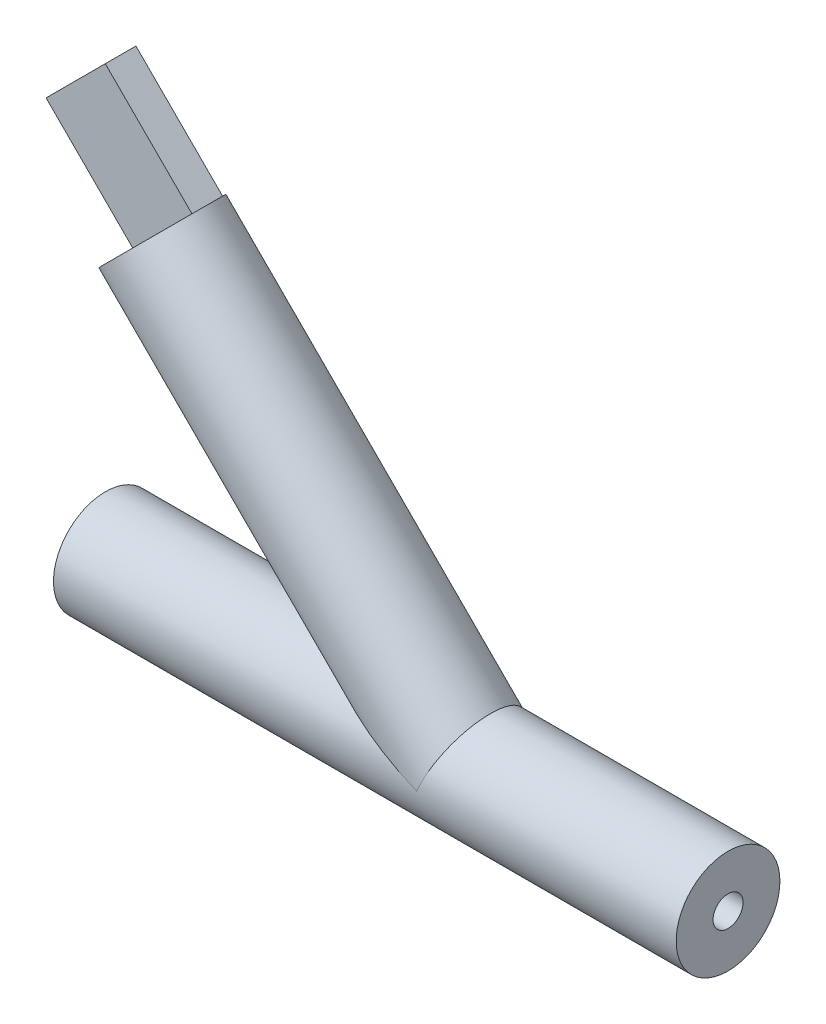
ISO-10303-21;
HEADER;
FILE_DESCRIPTION(('STEP AP214'),'2;1');
FILE_NAME('part.step','',(''),(''),'','','');
FILE_SCHEMA(('AUTOMOTIVE_DESIGN { 1 0 10303 214 1 1 1 1 }'));
ENDSEC;
DATA;
#1=APPLICATION_CONTEXT('core data for automotive mechanical design processes');
#2=APPLICATION_PROTOCOL_DEFINITION('international standard','automotive_design',2000,#1);
#3=PRODUCT_CONTEXT('',#1,'mechanical');
#4=PRODUCT('Part','Part','',(#3));
#5=PRODUCT_RELATED_PRODUCT_CATEGORY('part','',(#4));
#6=PRODUCT_DEFINITION_FORMATION('','',#4);
#7=PRODUCT_DEFINITION_CONTEXT('part definition',#1,'design');
#8=PRODUCT_DEFINITION('design','',#6,#7);
#9=PRODUCT_DEFINITION_SHAPE('','',#8);
#10=(LENGTH_UNIT() NAMED_UNIT(*) SI_UNIT(.MILLI.,.METRE.));
#11=(NAMED_UNIT(*) PLANE_ANGLE_UNIT() SI_UNIT($,.RADIAN.));
#12=(NAMED_UNIT(*) SI_UNIT($,.STERADIAN.) SOLID_ANGLE_UNIT());
#13=UNCERTAINTY_MEASURE_WITH_UNIT(LENGTH_MEASURE(1.E-05),#10,'distance_accuracy_value','');
#14=(GEOMETRIC_REPRESENTATION_CONTEXT(3) GLOBAL_UNCERTAINTY_ASSIGNED_CONTEXT((#13)) GLOBAL_UNIT_ASSIGNED_CONTEXT((#10,
#11,#12)) REPRESENTATION_CONTEXT('',''));
#15=CARTESIAN_POINT('',(0.,0.,0.));
#16=DIRECTION('',(0.,0.,1.));
#17=DIRECTION('',(1.,0.,0.));
#18=AXIS2_PLACEMENT_3D('',#15,#16,#17);
#19=CARTESIAN_POINT('',(13.9466811942258,74.9533188057739,0.));
#20=DIRECTION('',(-0.707106781186549,0.707106781186546,0.));
#21=DIRECTION('',(-0.707106781186546,-0.707106781186549,0.));
#22=AXIS2_PLACEMENT_3D('',#19,#20,#21);
#23=PLANE('',#22);
#24=DIRECTION('',(0.,0.,1.));
#25=VECTOR('',#24,1.);
#26=CARTESIAN_POINT('',(21.1937495670232,82.2003871785713,0.));
#27=LINE('',#26,#25);
#28=CARTESIAN_POINT('',(21.1937495670232,82.2003871785713,-7.49999999999998));
#29=VERTEX_POINT('',#28);
#30=CARTESIAN_POINT('',(21.1937495670232,82.2003871785713,0.));
#31=VERTEX_POINT('',#30);
#32=EDGE_CURVE('E108',#29,#31,#27,.T.);
#33=ORIENTED_EDGE('',*,*,#32,.T.);
#34=DIRECTION('',(-0.707106781186546,-0.707106781186549,0.));
#35=VECTOR('',#34,1.);
#36=CARTESIAN_POINT('',(-30.503318805774,30.5033188057739,0.));
#37=LINE('',#36,#35);
#38=CARTESIAN_POINT('',(6.69961282142845,67.7062504329765,0.));
#39=VERTEX_POINT('',#38);
#40=EDGE_CURVE('E50',#31,#39,#37,.T.);
#41=ORIENTED_EDGE('',*,*,#40,.T.);
#42=DIRECTION('',(0.,0.,1.));
#43=VECTOR('',#42,1.);
#44=CARTESIAN_POINT('',(6.69961282142845,67.7062504329765,0.));
#45=LINE('',#44,#43);
#46=CARTESIAN_POINT('',(6.69961282142844,67.7062504329765,-7.5));
#47=VERTEX_POINT('',#46);
#48=EDGE_CURVE('E96',#47,#39,#45,.T.);
#49=ORIENTED_EDGE('',*,*,#48,.F.);
#50=CARTESIAN_POINT('',(13.9466811942258,74.9533188057739,0.));
#51=DIRECTION('',(-0.707106781186549,0.707106781186546,0.));
#52=DIRECTION('',(-0.707106781186546,-0.707106781186549,0.));
#53=AXIS2_PLACEMENT_3D('',#50,#51,#52);
#54=CIRCLE('',#53,12.7);
#55=EDGE_CURVE('E86',#47,#29,#54,.T.);
#56=ORIENTED_EDGE('',*,*,#55,.T.);
#57=EDGE_LOOP('',(#33,#41,#49,#56));
#58=FACE_BOUND('',#57,.T.);
#59=ADVANCED_FACE('F35',(#58),#23,.T.);
#60=CARTESIAN_POINT('',(152.4,0.,0.));
#61=DIRECTION('',(-1.,0.,0.));
#62=DIRECTION('',(0.,0.,1.));
#63=AXIS2_PLACEMENT_3D('',#60,#61,#62);
#64=CYLINDRICAL_SURFACE('',#63,12.7);
#65=CARTESIAN_POINT('',(0.,0.,0.));
#66=DIRECTION('',(1.,0.,0.));
#67=DIRECTION('',(0.,0.,-1.));
#68=AXIS2_PLACEMENT_3D('',#65,#66,#67);
#69=CIRCLE('',#68,12.7);
#70=CARTESIAN_POINT('',(0.,0.,-12.7));
#71=VERTEX_POINT('',#70);
#72=EDGE_CURVE('E123',#71,#71,#69,.T.);
#73=ORIENTED_EDGE('',*,*,#72,.T.);
#74=EDGE_LOOP('',(#73));
#75=FACE_BOUND('',#74,.T.);
#76=CARTESIAN_POINT('',(152.4,0.,0.));
#77=DIRECTION('',(1.,0.,0.));
#78=DIRECTION('',(0.,0.,-1.));
#79=AXIS2_PLACEMENT_3D('',#76,#77,#78);
#80=CIRCLE('',#79,12.7);
#81=CARTESIAN_POINT('',(152.4,0.,-12.7));
#82=VERTEX_POINT('',#81);
#83=EDGE_CURVE('E124',#82,#82,#80,.T.);
#84=ORIENTED_EDGE('',*,*,#83,.F.);
#85=EDGE_LOOP('',(#84));
#86=FACE_BOUND('',#85,.T.);
#87=CARTESIAN_POINT('',(88.9,0.,0.));
#88=DIRECTION('',(-0.382683432365089,-0.923879532511287,0.));
#89=DIRECTION('',(-0.923879532511287,0.382683432365089,0.));
#90=AXIS2_PLACEMENT_3D('',#87,#88,#89);
#91=ELLIPSE('',#90,33.18669930786,12.7);
#92=CARTESIAN_POINT('',(88.9,0.,-12.7));
#93=VERTEX_POINT('',#92);
#94=CARTESIAN_POINT('',(88.9,0.,12.7));
#95=VERTEX_POINT('',#94);
#96=EDGE_CURVE('E11',#93,#95,#91,.F.);
#97=ORIENTED_EDGE('',*,*,#96,.F.);
#98=CARTESIAN_POINT('',(88.9,0.,0.));
#99=DIRECTION('',(-0.923879532511287,0.382683432365089,0.));
#100=DIRECTION('',(-0.382683432365089,-0.923879532511287,0.));
#101=AXIS2_PLACEMENT_3D('',#98,#99,#100);
#102=ELLIPSE('',#101,13.7463809437134,12.7);
#103=EDGE_CURVE('E43',#95,#93,#102,.T.);
#104=ORIENTED_EDGE('',*,*,#103,.F.);
#105=EDGE_LOOP('',(#97,#104));
#106=FACE_BOUND('',#105,.T.);
#107=ADVANCED_FACE('F37',(#75,#86,#106),#64,.T.);
#108=CARTESIAN_POINT('',(152.4,0.,0.));
#109=DIRECTION('',(1.,0.,0.));
#110=DIRECTION('',(0.,0.,-1.));
#111=AXIS2_PLACEMENT_3D('',#108,#109,#110);
#112=PLANE('',#111);
#113=CARTESIAN_POINT('',(152.4,0.,0.));
#114=DIRECTION('',(1.,0.,0.));
#115=DIRECTION('',(0.,0.,-1.));
#116=AXIS2_PLACEMENT_3D('',#113,#114,#115);
#117=CIRCLE('',#116,3.675);
#118=CARTESIAN_POINT('',(152.4,0.,-3.675));
#119=VERTEX_POINT('',#118);
#120=EDGE_CURVE('E182',#119,#119,#117,.T.);
#121=ORIENTED_EDGE('',*,*,#120,.F.);
#122=EDGE_LOOP('',(#121));
#123=FACE_BOUND('',#122,.T.);
#124=ORIENTED_EDGE('',*,*,#83,.T.);
#125=EDGE_LOOP('',(#124));
#126=FACE_BOUND('',#125,.T.);
#127=ADVANCED_FACE('F131',(#123,#126),#112,.T.);
#128=CARTESIAN_POINT('',(0.,0.,0.));
#129=DIRECTION('',(1.,0.,0.));
#130=DIRECTION('',(0.,0.,-1.));
#131=AXIS2_PLACEMENT_3D('',#128,#129,#130);
#132=PLANE('',#131);
#133=CARTESIAN_POINT('',(0.,0.,0.));
#134=DIRECTION('',(1.,0.,0.));
#135=DIRECTION('',(0.,0.,-1.));
#136=AXIS2_PLACEMENT_3D('',#133,#134,#135);
#137=CIRCLE('',#136,3.675);
#138=CARTESIAN_POINT('',(0.,0.,-3.675));
#139=VERTEX_POINT('',#138);
#140=EDGE_CURVE('E109',#139,#139,#137,.T.);
#141=ORIENTED_EDGE('',*,*,#140,.T.);
#142=EDGE_LOOP('',(#141));
#143=FACE_BOUND('',#142,.T.);
#144=ORIENTED_EDGE('',*,*,#72,.F.);
#145=EDGE_LOOP('',(#144));
#146=FACE_BOUND('',#145,.T.);
#147=ADVANCED_FACE('F137',(#143,#146),#132,.F.);
#148=CARTESIAN_POINT('',(13.9466811942258,74.9533188057739,0.));
#149=DIRECTION('',(0.707106781186549,-0.707106781186546,0.));
#150=DIRECTION('',(0.707106781186546,0.707106781186549,0.));
#151=AXIS2_PLACEMENT_3D('',#148,#149,#150);
#152=CYLINDRICAL_SURFACE('',#151,12.7);
#153=EDGE_CURVE('E120',#29,#47,#54,.T.);
#154=ORIENTED_EDGE('',*,*,#153,.F.);
#155=ORIENTED_EDGE('',*,*,#55,.F.);
#156=EDGE_LOOP('',(#154,#155));
#157=FACE_BOUND('',#156,.T.);
#158=ORIENTED_EDGE('',*,*,#103,.T.);
#159=ORIENTED_EDGE('',*,*,#96,.T.);
#160=EDGE_LOOP('',(#158,#159));
#161=FACE_BOUND('',#160,.T.);
#162=ADVANCED_FACE('F129',(#157,#161),#152,.T.);
#163=DIRECTION('',(-0.707106781186546,-0.707106781186549,0.));
#164=VECTOR('',#163,1.);
#165=CARTESIAN_POINT('',(-30.503318805774,30.5033188057739,-7.5));
#166=LINE('',#165,#164);
#167=EDGE_CURVE('E111',#29,#47,#166,.T.);
#168=ORIENTED_EDGE('',*,*,#167,.F.);
#169=ORIENTED_EDGE('',*,*,#153,.T.);
#170=EDGE_LOOP('',(#168,#169));
#171=FACE_BOUND('',#170,.T.);
#172=ADVANCED_FACE('F142',(#171),#23,.T.);
#173=CARTESIAN_POINT('',(-51.7165222413705,51.7165222413703,0.));
#174=DIRECTION('',(0.,0.,1.));
#175=DIRECTION('',(0.,-1.,0.));
#176=AXIS2_PLACEMENT_3D('',#173,#174,#175);
#177=PLANE('',#176);
#178=ORIENTED_EDGE('',*,*,#40,.F.);
#179=DIRECTION('',(0.707106781186549,-0.707106781186546,0.));
#180=VECTOR('',#179,1.);
#181=CARTESIAN_POINT('',(-0.0194538685732402,103.413590614168,0.));
#182=LINE('',#181,#180);
#183=CARTESIAN_POINT('',(-0.0194538685732402,103.413590614168,0.));
#184=VERTEX_POINT('',#183);
#185=EDGE_CURVE('E78',#184,#31,#182,.T.);
#186=ORIENTED_EDGE('',*,*,#185,.F.);
#187=DIRECTION('',(-0.707106781186546,-0.707106781186549,0.));
#188=VECTOR('',#187,1.);
#189=CARTESIAN_POINT('',(-51.7165222413705,51.7165222413703,0.));
#190=LINE('',#189,#188);
#191=CARTESIAN_POINT('',(-14.513590614168,88.9194538685729,0.));
#192=VERTEX_POINT('',#191);
#193=EDGE_CURVE('E81',#184,#192,#190,.T.);
#194=ORIENTED_EDGE('',*,*,#193,.T.);
#195=DIRECTION('',(0.707106781186549,-0.707106781186546,0.));
#196=VECTOR('',#195,1.);
#197=CARTESIAN_POINT('',(-14.513590614168,88.9194538685729,0.));
#198=LINE('',#197,#196);
#199=EDGE_CURVE('E106',#192,#39,#198,.T.);
#200=ORIENTED_EDGE('',*,*,#199,.T.);
#201=EDGE_LOOP('',(#178,#186,#194,#200));
#202=FACE_BOUND('',#201,.T.);
#203=ADVANCED_FACE('F80',(#202),#177,.T.);
#204=CARTESIAN_POINT('',(-0.0194538685732402,103.413590614168,0.));
#205=DIRECTION('',(0.707106781186546,0.707106781186549,0.));
#206=DIRECTION('',(-0.707106781186549,0.707106781186546,0.));
#207=AXIS2_PLACEMENT_3D('',#204,#205,#206);
#208=PLANE('',#207);
#209=ORIENTED_EDGE('',*,*,#32,.F.);
#210=DIRECTION('',(0.707106781186549,-0.707106781186546,0.));
#211=VECTOR('',#210,1.);
#212=CARTESIAN_POINT('',(-0.0194538685732472,103.413590614168,-7.49999999999998));
#213=LINE('',#212,#211);
#214=CARTESIAN_POINT('',(-0.0194538685732472,103.413590614168,-7.49999999999998));
#215=VERTEX_POINT('',#214);
#216=EDGE_CURVE('E87',#215,#29,#213,.T.);
#217=ORIENTED_EDGE('',*,*,#216,.F.);
#218=DIRECTION('',(0.,0.,1.));
#219=VECTOR('',#218,1.);
#220=CARTESIAN_POINT('',(-0.0194538685732402,103.413590614168,0.));
#221=LINE('',#220,#219);
#222=EDGE_CURVE('E92',#215,#184,#221,.T.);
#223=ORIENTED_EDGE('',*,*,#222,.T.);
#224=ORIENTED_EDGE('',*,*,#185,.T.);
#225=EDGE_LOOP('',(#209,#217,#223,#224));
#226=FACE_BOUND('',#225,.T.);
#227=ADVANCED_FACE('F98',(#226),#208,.T.);
#228=CARTESIAN_POINT('',(-51.7165222413705,51.7165222413703,-7.5));
#229=DIRECTION('',(0.,0.,1.));
#230=DIRECTION('',(1.,0.,0.));
#231=AXIS2_PLACEMENT_3D('',#228,#229,#230);
#232=PLANE('',#231);
#233=ORIENTED_EDGE('',*,*,#167,.T.);
#234=DIRECTION('',(0.707106781186549,-0.707106781186546,0.));
#235=VECTOR('',#234,1.);
#236=CARTESIAN_POINT('',(-14.513590614168,88.9194538685729,-7.5));
#237=LINE('',#236,#235);
#238=CARTESIAN_POINT('',(-14.513590614168,88.9194538685729,-7.5));
#239=VERTEX_POINT('',#238);
#240=EDGE_CURVE('E116',#239,#47,#237,.T.);
#241=ORIENTED_EDGE('',*,*,#240,.F.);
#242=DIRECTION('',(-0.707106781186546,-0.707106781186549,0.));
#243=VECTOR('',#242,1.);
#244=CARTESIAN_POINT('',(-51.7165222413705,51.7165222413703,-7.5));
#245=LINE('',#244,#243);
#246=EDGE_CURVE('E100',#215,#239,#245,.T.);
#247=ORIENTED_EDGE('',*,*,#246,.F.);
#248=ORIENTED_EDGE('',*,*,#216,.T.);
#249=EDGE_LOOP('',(#233,#241,#247,#248));
#250=FACE_BOUND('',#249,.T.);
#251=ADVANCED_FACE('F163',(#250),#232,.F.);
#252=CARTESIAN_POINT('',(-14.513590614168,88.9194538685729,0.));
#253=DIRECTION('',(0.707106781186546,0.707106781186549,0.));
#254=DIRECTION('',(-0.707106781186549,0.707106781186546,0.));
#255=AXIS2_PLACEMENT_3D('',#252,#253,#254);
#256=PLANE('',#255);
#257=ORIENTED_EDGE('',*,*,#48,.T.);
#258=ORIENTED_EDGE('',*,*,#199,.F.);
#259=DIRECTION('',(0.,0.,1.));
#260=VECTOR('',#259,1.);
#261=CARTESIAN_POINT('',(-14.513590614168,88.9194538685729,0.));
#262=LINE('',#261,#260);
#263=EDGE_CURVE('E94',#239,#192,#262,.T.);
#264=ORIENTED_EDGE('',*,*,#263,.F.);
#265=ORIENTED_EDGE('',*,*,#240,.T.);
#266=EDGE_LOOP('',(#257,#258,#264,#265));
#267=FACE_BOUND('',#266,.T.);
#268=ADVANCED_FACE('F166',(#267),#256,.F.);
#269=CARTESIAN_POINT('',(-51.7165222413705,51.7165222413703,0.));
#270=DIRECTION('',(-0.707106781186549,0.707106781186546,0.));
#271=DIRECTION('',(-0.707106781186546,-0.707106781186549,0.));
#272=AXIS2_PLACEMENT_3D('',#269,#270,#271);
#273=PLANE('',#272);
#274=ORIENTED_EDGE('',*,*,#193,.F.);
#275=ORIENTED_EDGE('',*,*,#222,.F.);
#276=ORIENTED_EDGE('',*,*,#246,.T.);
#277=ORIENTED_EDGE('',*,*,#263,.T.);
#278=EDGE_LOOP('',(#274,#275,#276,#277));
#279=FACE_BOUND('',#278,.T.);
#280=ADVANCED_FACE('F91',(#279),#273,.T.);
#281=CARTESIAN_POINT('',(0.,0.,0.));
#282=DIRECTION('',(1.,0.,0.));
#283=DIRECTION('',(0.,0.,-1.));
#284=AXIS2_PLACEMENT_3D('',#281,#282,#283);
#285=CYLINDRICAL_SURFACE('',#284,3.675);
#286=CARTESIAN_POINT('',(0.,0.,-3.675));
#287=CARTESIAN_POINT('',(1.5875,0.,-3.675));
#288=CARTESIAN_POINT('',(3.175,0.,-3.675));
#289=CARTESIAN_POINT('',(6.35,0.,-3.675));
#290=CARTESIAN_POINT('',(7.9375,0.,-3.675));
#291=CARTESIAN_POINT('',(11.1125,0.,-3.675));
#292=CARTESIAN_POINT('',(12.7,0.,-3.675));
#293=CARTESIAN_POINT('',(15.875,0.,-3.675));
#294=CARTESIAN_POINT('',(17.4625,0.,-3.675));
#295=CARTESIAN_POINT('',(20.6375,0.,-3.675));
#296=CARTESIAN_POINT('',(22.225,0.,-3.675));
#297=CARTESIAN_POINT('',(25.4,0.,-3.675));
#298=CARTESIAN_POINT('',(26.9875,0.,-3.675));
#299=CARTESIAN_POINT('',(30.1625,0.,-3.675));
#300=CARTESIAN_POINT('',(31.75,0.,-3.675));
#301=CARTESIAN_POINT('',(34.925,0.,-3.675));
#302=CARTESIAN_POINT('',(36.5125,0.,-3.675));
#303=CARTESIAN_POINT('',(39.6875,0.,-3.675));
#304=CARTESIAN_POINT('',(41.275,0.,-3.675));
#305=CARTESIAN_POINT('',(44.45,0.,-3.675));
#306=CARTESIAN_POINT('',(46.0375,0.,-3.675));
#307=CARTESIAN_POINT('',(49.2125,0.,-3.675));
#308=CARTESIAN_POINT('',(50.8,0.,-3.675));
#309=CARTESIAN_POINT('',(53.975,0.,-3.675));
#310=CARTESIAN_POINT('',(55.5625,0.,-3.675));
#311=CARTESIAN_POINT('',(58.7375,0.,-3.675));
#312=CARTESIAN_POINT('',(60.325,0.,-3.675));
#313=CARTESIAN_POINT('',(63.5,0.,-3.675));
#314=CARTESIAN_POINT('',(65.0875,0.,-3.675));
#315=CARTESIAN_POINT('',(68.2625,0.,-3.675));
#316=CARTESIAN_POINT('',(69.85,0.,-3.675));
#317=CARTESIAN_POINT('',(73.025,0.,-3.675));
#318=CARTESIAN_POINT('',(74.6125,0.,-3.675));
#319=CARTESIAN_POINT('',(77.7875,0.,-3.675));
#320=CARTESIAN_POINT('',(79.375,0.,-3.675));
#321=CARTESIAN_POINT('',(82.55,0.,-3.675));
#322=CARTESIAN_POINT('',(84.1375,0.,-3.675));
#323=CARTESIAN_POINT('',(87.3125,0.,-3.675));
#324=CARTESIAN_POINT('',(88.9,0.,-3.675));
#325=CARTESIAN_POINT('',(92.075,0.,-3.675));
#326=CARTESIAN_POINT('',(93.6625,0.,-3.675));
#327=CARTESIAN_POINT('',(96.8375,0.,-3.675));
#328=CARTESIAN_POINT('',(98.425,0.,-3.675));
#329=CARTESIAN_POINT('',(101.6,0.,-3.675));
#330=CARTESIAN_POINT('',(103.1875,0.,-3.675));
#331=CARTESIAN_POINT('',(106.3625,0.,-3.675));
#332=CARTESIAN_POINT('',(107.95,0.,-3.675));
#333=CARTESIAN_POINT('',(111.125,0.,-3.675));
#334=CARTESIAN_POINT('',(112.7125,0.,-3.675));
#335=CARTESIAN_POINT('',(115.8875,0.,-3.675));
#336=CARTESIAN_POINT('',(117.475,0.,-3.675));
#337=CARTESIAN_POINT('',(120.65,0.,-3.675));
#338=CARTESIAN_POINT('',(122.2375,0.,-3.675));
#339=CARTESIAN_POINT('',(125.4125,0.,-3.675));
#340=CARTESIAN_POINT('',(127.,0.,-3.675));
#341=CARTESIAN_POINT('',(130.175,0.,-3.675));
#342=CARTESIAN_POINT('',(131.7625,0.,-3.675));
#343=CARTESIAN_POINT('',(134.9375,0.,-3.675));
#344=CARTESIAN_POINT('',(136.525,0.,-3.675));
#345=CARTESIAN_POINT('',(139.7,0.,-3.675));
#346=CARTESIAN_POINT('',(141.2875,0.,-3.675));
#347=CARTESIAN_POINT('',(144.4625,0.,-3.675));
#348=CARTESIAN_POINT('',(146.05,0.,-3.675));
#349=CARTESIAN_POINT('',(149.225,0.,-3.675));
#350=CARTESIAN_POINT('',(150.8125,0.,-3.675));
#351=CARTESIAN_POINT('',(152.4,0.,-3.675));
#352=B_SPLINE_CURVE_WITH_KNOTS('',3,(#286,#287,#288,#289,#290,#291,#292,#293,#294,#295,#296,
#297,#298,#299,#300,#301,#302,#303,#304,#305,#306,#307,#308,#309,#310,#311,#312,#313,#314,#315,
#316,#317,#318,#319,#320,#321,#322,#323,#324,#325,#326,#327,#328,#329,#330,#331,#332,#333,#334,
#335,#336,#337,#338,#339,#340,#341,#342,#343,#344,#345,#346,#347,#348,#349,#350,#351),
.UNSPECIFIED.,.F.,.F.,(4,2,2,2,2,2,2,2,2,2,2,2,2,2,2,2,2,2,2,2,2,2,2,2,2,2,2,2,2,2,2,2,4),(0.,
4.7625,9.525,14.2875,19.05,23.8125,28.575,33.3375,38.1,42.8625,47.625,52.3875,57.15,61.9125,
66.675,71.4375,76.2,80.9625,85.725,90.4875,95.25,100.0125,104.775,109.5375,114.3,119.0625,
123.825,128.5875,133.35,138.1125,142.875,147.6375,152.4),.UNSPECIFIED.);
#353=EDGE_CURVE('BSEAM173',#139,#119,#352,.T.);
#354=ORIENTED_EDGE('',*,*,#140,.F.);
#355=ORIENTED_EDGE('',*,*,#120,.T.);
#356=ORIENTED_EDGE('',*,*,#353,.T.);
#357=ORIENTED_EDGE('',*,*,#353,.F.);
#358=EDGE_LOOP('',(#354,#356,#355,#357));
#359=FACE_BOUND('',#358,.T.);
#360=ADVANCED_FACE('F173',(#359),#285,.F.);
#361=CLOSED_SHELL('',(#59,#107,#127,#147,#162,#172,#203,#227,#251,#268,#280,#360));
#362=MANIFOLD_SOLID_BREP('B2',#361);
#363=ADVANCED_BREP_SHAPE_REPRESENTATION('',(#18,#362),#14);
#364=SHAPE_DEFINITION_REPRESENTATION(#9,#363);
ENDSEC;
END-ISO-10303-21;
